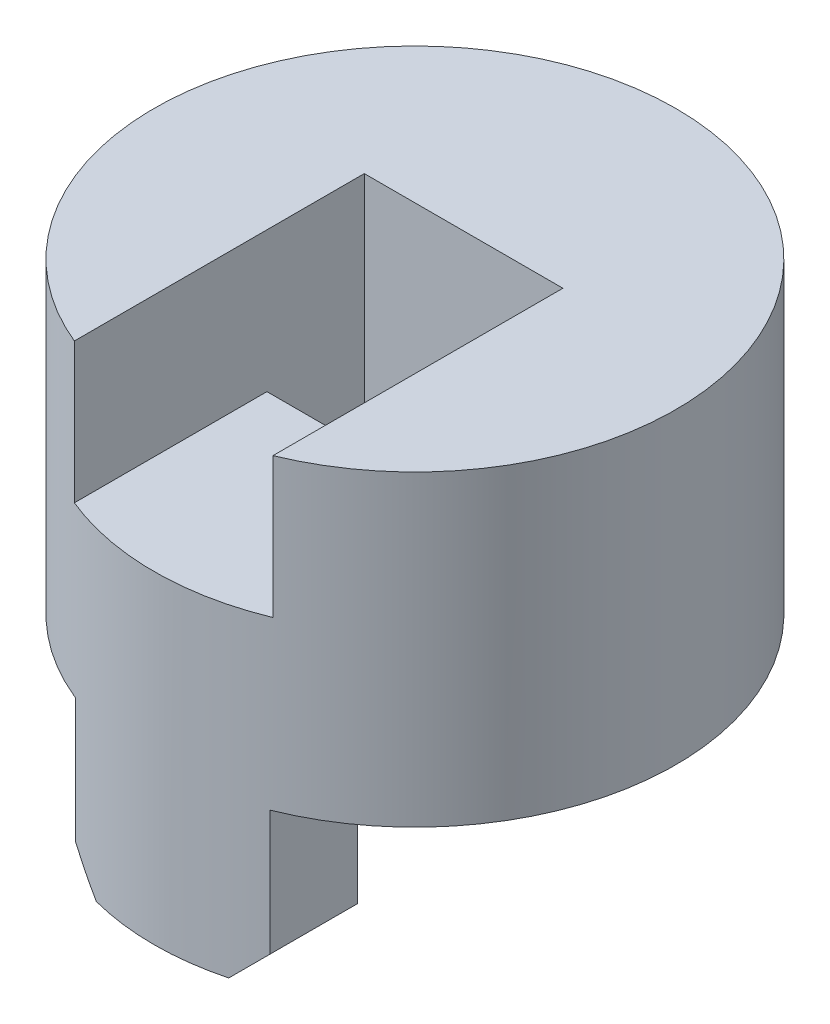
ISO-10303-21;
HEADER;
FILE_DESCRIPTION(('STEP AP214'),'2;1');
FILE_NAME('part.step','',(''),(''),'','','');
FILE_SCHEMA(('AUTOMOTIVE_DESIGN { 1 0 10303 214 1 1 1 1 }'));
ENDSEC;
DATA;
#1=APPLICATION_CONTEXT('core data for automotive mechanical design processes');
#2=APPLICATION_PROTOCOL_DEFINITION('international standard','automotive_design',2000,#1);
#3=PRODUCT_CONTEXT('',#1,'mechanical');
#4=PRODUCT('Part','Part','',(#3));
#5=PRODUCT_RELATED_PRODUCT_CATEGORY('part','',(#4));
#6=PRODUCT_DEFINITION_FORMATION('','',#4);
#7=PRODUCT_DEFINITION_CONTEXT('part definition',#1,'design');
#8=PRODUCT_DEFINITION('design','',#6,#7);
#9=PRODUCT_DEFINITION_SHAPE('','',#8);
#10=(LENGTH_UNIT() NAMED_UNIT(*) SI_UNIT(.MILLI.,.METRE.));
#11=(NAMED_UNIT(*) PLANE_ANGLE_UNIT() SI_UNIT($,.RADIAN.));
#12=(NAMED_UNIT(*) SI_UNIT($,.STERADIAN.) SOLID_ANGLE_UNIT());
#13=UNCERTAINTY_MEASURE_WITH_UNIT(LENGTH_MEASURE(1.E-05),#10,'distance_accuracy_value','');
#14=(GEOMETRIC_REPRESENTATION_CONTEXT(3) GLOBAL_UNCERTAINTY_ASSIGNED_CONTEXT((#13)) GLOBAL_UNIT_ASSIGNED_CONTEXT((#10,
#11,#12)) REPRESENTATION_CONTEXT('',''));
#15=CARTESIAN_POINT('',(0.,0.,0.));
#16=DIRECTION('',(0.,0.,1.));
#17=DIRECTION('',(1.,0.,0.));
#18=AXIS2_PLACEMENT_3D('',#15,#16,#17);
#19=CARTESIAN_POINT('',(0.,1.1,0.));
#20=DIRECTION('',(0.,1.,0.));
#21=DIRECTION('',(0.,0.,1.));
#22=AXIS2_PLACEMENT_3D('',#19,#20,#21);
#23=PLANE('',#22);
#24=CARTESIAN_POINT('',(0.,1.1,0.));
#25=DIRECTION('',(0.,1.,0.));
#26=DIRECTION('',(0.,0.,1.));
#27=AXIS2_PLACEMENT_3D('',#24,#25,#26);
#28=CIRCLE('',#27,3.45);
#29=CARTESIAN_POINT('',(0.,1.1,3.45));
#30=VERTEX_POINT('',#29);
#31=EDGE_CURVE('E198',#30,#30,#28,.T.);
#32=ORIENTED_EDGE('',*,*,#31,.T.);
#33=EDGE_LOOP('',(#32));
#34=FACE_BOUND('',#33,.T.);
#35=DIRECTION('',(0.,0.,1.));
#36=VECTOR('',#35,1.);
#37=CARTESIAN_POINT('',(2.5,1.1,0.));
#38=LINE('',#37,#36);
#39=CARTESIAN_POINT('',(2.5,1.1,3.97994974842648));
#40=VERTEX_POINT('',#39);
#41=CARTESIAN_POINT('',(2.5,1.1,6.21610810716802));
#42=VERTEX_POINT('',#41);
#43=EDGE_CURVE('E170',#40,#42,#38,.T.);
#44=ORIENTED_EDGE('',*,*,#43,.F.);
#45=CARTESIAN_POINT('',(0.,1.1,0.));
#46=DIRECTION('',(0.,-1.,0.));
#47=DIRECTION('',(0.,0.,-1.));
#48=AXIS2_PLACEMENT_3D('',#45,#46,#47);
#49=CIRCLE('',#48,4.7);
#50=CARTESIAN_POINT('',(-2.5,1.1,3.97994974842648));
#51=VERTEX_POINT('',#50);
#52=EDGE_CURVE('E159',#40,#51,#49,.T.);
#53=ORIENTED_EDGE('',*,*,#52,.T.);
#54=DIRECTION('',(0.,0.,1.));
#55=VECTOR('',#54,1.);
#56=CARTESIAN_POINT('',(-2.5,1.1,0.));
#57=LINE('',#56,#55);
#58=CARTESIAN_POINT('',(-2.5,1.1,6.21610810716802));
#59=VERTEX_POINT('',#58);
#60=EDGE_CURVE('E164',#51,#59,#57,.T.);
#61=ORIENTED_EDGE('',*,*,#60,.T.);
#62=CARTESIAN_POINT('',(0.,1.1,0.));
#63=DIRECTION('',(0.,1.,0.));
#64=DIRECTION('',(0.,0.,1.));
#65=AXIS2_PLACEMENT_3D('',#62,#63,#64);
#66=CIRCLE('',#65,6.7);
#67=EDGE_CURVE('E193',#42,#59,#66,.T.);
#68=ORIENTED_EDGE('',*,*,#67,.F.);
#69=EDGE_LOOP('',(#44,#53,#61,#68));
#70=FACE_BOUND('',#69,.T.);
#71=ADVANCED_FACE('F37',(#34,#70),#23,.F.);
#72=CARTESIAN_POINT('',(0.,1.1,0.));
#73=DIRECTION('',(0.,-1.,0.));
#74=DIRECTION('',(0.,0.,-1.));
#75=AXIS2_PLACEMENT_3D('',#72,#73,#74);
#76=CYLINDRICAL_SURFACE('',#75,3.45);
#77=ORIENTED_EDGE('',*,*,#31,.F.);
#78=EDGE_LOOP('',(#77));
#79=FACE_BOUND('',#78,.T.);
#80=CARTESIAN_POINT('',(0.,0.,0.));
#81=DIRECTION('',(0.,1.,0.));
#82=DIRECTION('',(0.,0.,1.));
#83=AXIS2_PLACEMENT_3D('',#80,#81,#82);
#84=CIRCLE('',#83,3.45);
#85=CARTESIAN_POINT('',(0.,0.,3.45));
#86=VERTEX_POINT('',#85);
#87=EDGE_CURVE('E202',#86,#86,#84,.T.);
#88=ORIENTED_EDGE('',*,*,#87,.T.);
#89=EDGE_LOOP('',(#88));
#90=FACE_BOUND('',#89,.T.);
#91=ADVANCED_FACE('F258',(#79,#90),#76,.T.);
#92=CARTESIAN_POINT('',(0.,0.,0.));
#93=DIRECTION('',(0.,1.,0.));
#94=DIRECTION('',(0.,0.,1.));
#95=AXIS2_PLACEMENT_3D('',#92,#93,#94);
#96=PLANE('',#95);
#97=DIRECTION('',(1.,0.,0.));
#98=VECTOR('',#97,1.);
#99=CARTESIAN_POINT('',(-2.55,0.,1.25));
#100=LINE('',#99,#98);
#101=CARTESIAN_POINT('',(-2.55,0.,1.25));
#102=VERTEX_POINT('',#101);
#103=CARTESIAN_POINT('',(2.55,0.,1.25));
#104=VERTEX_POINT('',#103);
#105=EDGE_CURVE('E189',#102,#104,#100,.T.);
#106=ORIENTED_EDGE('',*,*,#105,.T.);
#107=DIRECTION('',(0.,0.,-1.));
#108=VECTOR('',#107,1.);
#109=CARTESIAN_POINT('',(2.55,0.,1.25));
#110=LINE('',#109,#108);
#111=CARTESIAN_POINT('',(2.55,0.,-1.25));
#112=VERTEX_POINT('',#111);
#113=EDGE_CURVE('E183',#104,#112,#110,.T.);
#114=ORIENTED_EDGE('',*,*,#113,.T.);
#115=DIRECTION('',(-1.,0.,0.));
#116=VECTOR('',#115,1.);
#117=CARTESIAN_POINT('',(-2.55,0.,-1.25));
#118=LINE('',#117,#116);
#119=CARTESIAN_POINT('',(-2.55,0.,-1.25));
#120=VERTEX_POINT('',#119);
#121=EDGE_CURVE('E186',#112,#120,#118,.T.);
#122=ORIENTED_EDGE('',*,*,#121,.T.);
#123=DIRECTION('',(0.,0.,1.));
#124=VECTOR('',#123,1.);
#125=CARTESIAN_POINT('',(-2.55,0.,1.25));
#126=LINE('',#125,#124);
#127=EDGE_CURVE('E132',#120,#102,#126,.T.);
#128=ORIENTED_EDGE('',*,*,#127,.T.);
#129=EDGE_LOOP('',(#106,#114,#122,#128));
#130=FACE_BOUND('',#129,.T.);
#131=ORIENTED_EDGE('',*,*,#87,.F.);
#132=EDGE_LOOP('',(#131));
#133=FACE_BOUND('',#132,.T.);
#134=ADVANCED_FACE('F255',(#130,#133),#96,.F.);
#135=CARTESIAN_POINT('',(0.,5.4,0.));
#136=DIRECTION('',(0.,-1.,0.));
#137=DIRECTION('',(0.,0.,-1.));
#138=AXIS2_PLACEMENT_3D('',#135,#136,#137);
#139=CYLINDRICAL_SURFACE('',#138,6.7);
#140=CARTESIAN_POINT('',(0.,5.4,0.));
#141=DIRECTION('',(0.,1.,0.));
#142=DIRECTION('',(0.,0.,1.));
#143=AXIS2_PLACEMENT_3D('',#140,#141,#142);
#144=CIRCLE('',#143,6.7);
#145=CARTESIAN_POINT('',(-2.55,5.4,6.19576468242621));
#146=VERTEX_POINT('',#145);
#147=CARTESIAN_POINT('',(2.55,5.4,6.19576468242621));
#148=VERTEX_POINT('',#147);
#149=EDGE_CURVE('E196',#146,#148,#144,.T.);
#150=ORIENTED_EDGE('',*,*,#149,.F.);
#151=DIRECTION('',(0.,-1.,0.));
#152=VECTOR('',#151,1.);
#153=CARTESIAN_POINT('',(-2.55,35.4973317103425,6.19576468242621));
#154=LINE('',#153,#152);
#155=CARTESIAN_POINT('',(-2.55,9.,6.19576468242621));
#156=VERTEX_POINT('',#155);
#157=EDGE_CURVE('E54',#156,#146,#154,.T.);
#158=ORIENTED_EDGE('',*,*,#157,.F.);
#159=CARTESIAN_POINT('',(0.,9.,0.));
#160=DIRECTION('',(0.,1.,0.));
#161=DIRECTION('',(0.,0.,1.));
#162=AXIS2_PLACEMENT_3D('',#159,#160,#161);
#163=CIRCLE('',#162,6.7);
#164=CARTESIAN_POINT('',(2.55,9.,6.19576468242621));
#165=VERTEX_POINT('',#164);
#166=EDGE_CURVE('E149',#165,#156,#163,.T.);
#167=ORIENTED_EDGE('',*,*,#166,.F.);
#168=DIRECTION('',(0.,-1.,0.));
#169=VECTOR('',#168,1.);
#170=CARTESIAN_POINT('',(2.55,35.4973317103425,6.19576468242621));
#171=LINE('',#170,#169);
#172=EDGE_CURVE('E150',#165,#148,#171,.T.);
#173=ORIENTED_EDGE('',*,*,#172,.T.);
#174=EDGE_LOOP('',(#150,#158,#167,#173));
#175=FACE_BOUND('',#174,.T.);
#176=CARTESIAN_POINT('',(0.,-2.9,0.));
#177=DIRECTION('',(0.,-1.,0.));
#178=DIRECTION('',(0.,0.,-1.));
#179=AXIS2_PLACEMENT_3D('',#176,#177,#178);
#180=CIRCLE('',#179,6.7);
#181=CARTESIAN_POINT('',(1.7,-2.9,6.48074069840786));
#182=VERTEX_POINT('',#181);
#183=CARTESIAN_POINT('',(-1.69999999999999,-2.9,6.48074069840786));
#184=VERTEX_POINT('',#183);
#185=EDGE_CURVE('E163',#182,#184,#180,.T.);
#186=ORIENTED_EDGE('',*,*,#185,.F.);
#187=CARTESIAN_POINT('',(0.,-4.6,0.));
#188=DIRECTION('',(0.707106781186549,-0.707106781186546,0.));
#189=DIRECTION('',(-0.707106781186546,-0.707106781186549,0.));
#190=AXIS2_PLACEMENT_3D('',#187,#188,#189);
#191=ELLIPSE('',#190,9.47523086789976,6.7);
#192=CARTESIAN_POINT('',(2.5,-2.09999999999999,6.21610810716802));
#193=VERTEX_POINT('',#192);
#194=EDGE_CURVE('E211',#182,#193,#191,.F.);
#195=ORIENTED_EDGE('',*,*,#194,.T.);
#196=DIRECTION('',(0.,1.,0.));
#197=VECTOR('',#196,1.);
#198=CARTESIAN_POINT('',(2.5,-2.9,6.21610810716802));
#199=LINE('',#198,#197);
#200=EDGE_CURVE('E178',#193,#42,#199,.T.);
#201=ORIENTED_EDGE('',*,*,#200,.T.);
#202=ORIENTED_EDGE('',*,*,#67,.T.);
#203=DIRECTION('',(0.,1.,0.));
#204=VECTOR('',#203,1.);
#205=CARTESIAN_POINT('',(-2.5,-2.9,6.21610810716802));
#206=LINE('',#205,#204);
#207=CARTESIAN_POINT('',(-2.5,-2.1,6.21610810716802));
#208=VERTEX_POINT('',#207);
#209=EDGE_CURVE('E176',#208,#59,#206,.T.);
#210=ORIENTED_EDGE('',*,*,#209,.F.);
#211=CARTESIAN_POINT('',(0.,-4.59999999999999,0.));
#212=DIRECTION('',(0.707106781186546,0.707106781186549,0.));
#213=DIRECTION('',(0.707106781186549,-0.707106781186546,0.));
#214=AXIS2_PLACEMENT_3D('',#211,#212,#213);
#215=ELLIPSE('',#214,9.47523086789972,6.7);
#216=EDGE_CURVE('E209',#208,#184,#215,.T.);
#217=ORIENTED_EDGE('',*,*,#216,.T.);
#218=EDGE_LOOP('',(#186,#195,#201,#202,#210,#217));
#219=FACE_BOUND('',#218,.T.);
#220=ADVANCED_FACE('F252',(#175,#219),#139,.T.);
#221=CARTESIAN_POINT('',(0.,5.4,0.));
#222=DIRECTION('',(0.,1.,0.));
#223=DIRECTION('',(0.,0.,1.));
#224=AXIS2_PLACEMENT_3D('',#221,#222,#223);
#225=PLANE('',#224);
#226=DIRECTION('',(0.,0.,1.));
#227=VECTOR('',#226,1.);
#228=CARTESIAN_POINT('',(2.55,5.4,0.));
#229=LINE('',#228,#227);
#230=CARTESIAN_POINT('',(2.55,5.4,1.25));
#231=VERTEX_POINT('',#230);
#232=EDGE_CURVE('E12',#231,#148,#229,.T.);
#233=ORIENTED_EDGE('',*,*,#232,.F.);
#234=DIRECTION('',(1.,0.,0.));
#235=VECTOR('',#234,1.);
#236=CARTESIAN_POINT('',(-2.55,5.4,1.25));
#237=LINE('',#236,#235);
#238=CARTESIAN_POINT('',(-2.55,5.4,1.25));
#239=VERTEX_POINT('',#238);
#240=EDGE_CURVE('E182',#239,#231,#237,.T.);
#241=ORIENTED_EDGE('',*,*,#240,.F.);
#242=DIRECTION('',(0.,0.,1.));
#243=VECTOR('',#242,1.);
#244=CARTESIAN_POINT('',(-2.55,5.4,0.));
#245=LINE('',#244,#243);
#246=EDGE_CURVE('E46',#239,#146,#245,.T.);
#247=ORIENTED_EDGE('',*,*,#246,.T.);
#248=ORIENTED_EDGE('',*,*,#149,.T.);
#249=EDGE_LOOP('',(#233,#241,#247,#248));
#250=FACE_BOUND('',#249,.T.);
#251=ADVANCED_FACE('F249',(#250),#225,.T.);
#252=CARTESIAN_POINT('',(2.55,0.,1.25));
#253=DIRECTION('',(1.,0.,0.));
#254=DIRECTION('',(0.,0.,-1.));
#255=AXIS2_PLACEMENT_3D('',#252,#253,#254);
#256=PLANE('',#255);
#257=DIRECTION('',(0.,1.,0.));
#258=VECTOR('',#257,1.);
#259=CARTESIAN_POINT('',(2.55,0.,1.25));
#260=LINE('',#259,#258);
#261=EDGE_CURVE('E197',#104,#231,#260,.T.);
#262=ORIENTED_EDGE('',*,*,#261,.T.);
#263=ORIENTED_EDGE('',*,*,#232,.T.);
#264=ORIENTED_EDGE('',*,*,#172,.F.);
#265=DIRECTION('',(0.,0.,1.));
#266=VECTOR('',#265,1.);
#267=CARTESIAN_POINT('',(2.55,9.,0.));
#268=LINE('',#267,#266);
#269=CARTESIAN_POINT('',(2.55,9.,-1.25));
#270=VERTEX_POINT('',#269);
#271=EDGE_CURVE('E145',#270,#165,#268,.T.);
#272=ORIENTED_EDGE('',*,*,#271,.F.);
#273=DIRECTION('',(0.,1.,0.));
#274=VECTOR('',#273,1.);
#275=CARTESIAN_POINT('',(2.55,0.,-1.25));
#276=LINE('',#275,#274);
#277=EDGE_CURVE('E137',#112,#270,#276,.T.);
#278=ORIENTED_EDGE('',*,*,#277,.F.);
#279=ORIENTED_EDGE('',*,*,#113,.F.);
#280=EDGE_LOOP('',(#262,#263,#264,#272,#278,#279));
#281=FACE_BOUND('',#280,.T.);
#282=ADVANCED_FACE('F242',(#281),#256,.F.);
#283=CARTESIAN_POINT('',(-2.55,0.,1.25));
#284=DIRECTION('',(0.,0.,1.));
#285=DIRECTION('',(1.,0.,0.));
#286=AXIS2_PLACEMENT_3D('',#283,#284,#285);
#287=PLANE('',#286);
#288=ORIENTED_EDGE('',*,*,#240,.T.);
#289=ORIENTED_EDGE('',*,*,#261,.F.);
#290=ORIENTED_EDGE('',*,*,#105,.F.);
#291=DIRECTION('',(0.,1.,0.));
#292=VECTOR('',#291,1.);
#293=CARTESIAN_POINT('',(-2.55,0.,1.25));
#294=LINE('',#293,#292);
#295=EDGE_CURVE('E136',#102,#239,#294,.T.);
#296=ORIENTED_EDGE('',*,*,#295,.T.);
#297=EDGE_LOOP('',(#288,#289,#290,#296));
#298=FACE_BOUND('',#297,.T.);
#299=ADVANCED_FACE('F247',(#298),#287,.F.);
#300=CARTESIAN_POINT('',(-2.55,0.,1.25));
#301=DIRECTION('',(-1.,0.,0.));
#302=DIRECTION('',(0.,0.,1.));
#303=AXIS2_PLACEMENT_3D('',#300,#301,#302);
#304=PLANE('',#303);
#305=DIRECTION('',(0.,1.,0.));
#306=VECTOR('',#305,1.);
#307=CARTESIAN_POINT('',(-2.55,0.,-1.25));
#308=LINE('',#307,#306);
#309=CARTESIAN_POINT('',(-2.55,9.,-1.25));
#310=VERTEX_POINT('',#309);
#311=EDGE_CURVE('E126',#120,#310,#308,.T.);
#312=ORIENTED_EDGE('',*,*,#311,.T.);
#313=DIRECTION('',(0.,0.,1.));
#314=VECTOR('',#313,1.);
#315=CARTESIAN_POINT('',(-2.55,9.,0.));
#316=LINE('',#315,#314);
#317=EDGE_CURVE('E130',#310,#156,#316,.T.);
#318=ORIENTED_EDGE('',*,*,#317,.T.);
#319=ORIENTED_EDGE('',*,*,#157,.T.);
#320=ORIENTED_EDGE('',*,*,#246,.F.);
#321=ORIENTED_EDGE('',*,*,#295,.F.);
#322=ORIENTED_EDGE('',*,*,#127,.F.);
#323=EDGE_LOOP('',(#312,#318,#319,#320,#321,#322));
#324=FACE_BOUND('',#323,.T.);
#325=ADVANCED_FACE('F128',(#324),#304,.F.);
#326=CARTESIAN_POINT('',(-2.55,0.,-1.25));
#327=DIRECTION('',(0.,0.,-1.));
#328=DIRECTION('',(-1.,0.,0.));
#329=AXIS2_PLACEMENT_3D('',#326,#327,#328);
#330=PLANE('',#329);
#331=ORIENTED_EDGE('',*,*,#277,.T.);
#332=DIRECTION('',(1.,0.,0.));
#333=VECTOR('',#332,1.);
#334=CARTESIAN_POINT('',(0.,9.,-1.25));
#335=LINE('',#334,#333);
#336=EDGE_CURVE('E140',#310,#270,#335,.T.);
#337=ORIENTED_EDGE('',*,*,#336,.F.);
#338=ORIENTED_EDGE('',*,*,#311,.F.);
#339=ORIENTED_EDGE('',*,*,#121,.F.);
#340=EDGE_LOOP('',(#331,#337,#338,#339));
#341=FACE_BOUND('',#340,.T.);
#342=ADVANCED_FACE('F141',(#341),#330,.F.);
#343=CARTESIAN_POINT('',(0.,-2.9,0.));
#344=DIRECTION('',(0.,1.,0.));
#345=DIRECTION('',(0.,0.,1.));
#346=AXIS2_PLACEMENT_3D('',#343,#344,#345);
#347=CYLINDRICAL_SURFACE('',#346,4.7);
#348=DIRECTION('',(0.,1.,0.));
#349=VECTOR('',#348,1.);
#350=CARTESIAN_POINT('',(2.5,-2.9,3.97994974842648));
#351=LINE('',#350,#349);
#352=CARTESIAN_POINT('',(2.5,-2.09999999999999,3.97994974842648));
#353=VERTEX_POINT('',#352);
#354=EDGE_CURVE('E180',#353,#40,#351,.T.);
#355=ORIENTED_EDGE('',*,*,#354,.F.);
#356=CARTESIAN_POINT('',(0.,-4.6,0.));
#357=DIRECTION('',(0.707106781186549,-0.707106781186546,0.));
#358=DIRECTION('',(0.707106781186546,0.707106781186549,0.));
#359=AXIS2_PLACEMENT_3D('',#356,#357,#358);
#360=ELLIPSE('',#359,6.64680374315356,4.7);
#361=CARTESIAN_POINT('',(1.7,-2.9,4.38178046004133));
#362=VERTEX_POINT('',#361);
#363=EDGE_CURVE('E216',#353,#362,#360,.T.);
#364=ORIENTED_EDGE('',*,*,#363,.T.);
#365=CARTESIAN_POINT('',(0.,-2.9,0.));
#366=DIRECTION('',(0.,-1.,0.));
#367=DIRECTION('',(0.,0.,-1.));
#368=AXIS2_PLACEMENT_3D('',#365,#366,#367);
#369=CIRCLE('',#368,4.7);
#370=CARTESIAN_POINT('',(-1.7,-2.9,4.38178046004133));
#371=VERTEX_POINT('',#370);
#372=EDGE_CURVE('E161',#362,#371,#369,.T.);
#373=ORIENTED_EDGE('',*,*,#372,.T.);
#374=CARTESIAN_POINT('',(0.,-4.59999999999999,0.));
#375=DIRECTION('',(0.707106781186546,0.707106781186549,0.));
#376=DIRECTION('',(-0.707106781186549,0.707106781186546,0.));
#377=AXIS2_PLACEMENT_3D('',#374,#375,#376);
#378=ELLIPSE('',#377,6.64680374315353,4.7);
#379=CARTESIAN_POINT('',(-2.5,-2.1,3.97994974842648));
#380=VERTEX_POINT('',#379);
#381=EDGE_CURVE('E62',#371,#380,#378,.F.);
#382=ORIENTED_EDGE('',*,*,#381,.T.);
#383=DIRECTION('',(0.,1.,0.));
#384=VECTOR('',#383,1.);
#385=CARTESIAN_POINT('',(-2.5,-2.9,3.97994974842648));
#386=LINE('',#385,#384);
#387=EDGE_CURVE('E167',#380,#51,#386,.T.);
#388=ORIENTED_EDGE('',*,*,#387,.T.);
#389=ORIENTED_EDGE('',*,*,#52,.F.);
#390=EDGE_LOOP('',(#355,#364,#373,#382,#388,#389));
#391=FACE_BOUND('',#390,.T.);
#392=ADVANCED_FACE('F289',(#391),#347,.F.);
#393=CARTESIAN_POINT('',(2.5,-2.9,0.));
#394=DIRECTION('',(-1.,0.,0.));
#395=DIRECTION('',(0.,0.,1.));
#396=AXIS2_PLACEMENT_3D('',#393,#394,#395);
#397=PLANE('',#396);
#398=ORIENTED_EDGE('',*,*,#200,.F.);
#399=DIRECTION('',(0.,0.,-1.));
#400=VECTOR('',#399,1.);
#401=CARTESIAN_POINT('',(2.5,-2.09999999999999,3.97994974842648));
#402=LINE('',#401,#400);
#403=EDGE_CURVE('E213',#193,#353,#402,.T.);
#404=ORIENTED_EDGE('',*,*,#403,.T.);
#405=ORIENTED_EDGE('',*,*,#354,.T.);
#406=ORIENTED_EDGE('',*,*,#43,.T.);
#407=EDGE_LOOP('',(#398,#404,#405,#406));
#408=FACE_BOUND('',#407,.T.);
#409=ADVANCED_FACE('F302',(#408),#397,.F.);
#410=CARTESIAN_POINT('',(-2.5,-2.9,0.));
#411=DIRECTION('',(-1.,0.,0.));
#412=DIRECTION('',(0.,0.,1.));
#413=AXIS2_PLACEMENT_3D('',#410,#411,#412);
#414=PLANE('',#413);
#415=ORIENTED_EDGE('',*,*,#387,.F.);
#416=DIRECTION('',(0.,0.,1.));
#417=VECTOR('',#416,1.);
#418=CARTESIAN_POINT('',(-2.5,-2.1,0.));
#419=LINE('',#418,#417);
#420=EDGE_CURVE('E218',#380,#208,#419,.T.);
#421=ORIENTED_EDGE('',*,*,#420,.T.);
#422=ORIENTED_EDGE('',*,*,#209,.T.);
#423=ORIENTED_EDGE('',*,*,#60,.F.);
#424=EDGE_LOOP('',(#415,#421,#422,#423));
#425=FACE_BOUND('',#424,.T.);
#426=ADVANCED_FACE('F281',(#425),#414,.T.);
#427=CARTESIAN_POINT('',(0.,-2.9,0.));
#428=DIRECTION('',(0.,-1.,0.));
#429=DIRECTION('',(0.,0.,-1.));
#430=AXIS2_PLACEMENT_3D('',#427,#428,#429);
#431=PLANE('',#430);
#432=ORIENTED_EDGE('',*,*,#372,.F.);
#433=DIRECTION('',(0.,0.,1.));
#434=VECTOR('',#433,1.);
#435=CARTESIAN_POINT('',(1.7,-2.9,6.21610810716802));
#436=LINE('',#435,#434);
#437=EDGE_CURVE('E206',#362,#182,#436,.T.);
#438=ORIENTED_EDGE('',*,*,#437,.T.);
#439=ORIENTED_EDGE('',*,*,#185,.T.);
#440=DIRECTION('',(0.,0.,-1.));
#441=VECTOR('',#440,1.);
#442=CARTESIAN_POINT('',(-1.69999999999999,-2.9,0.));
#443=LINE('',#442,#441);
#444=EDGE_CURVE('E201',#184,#371,#443,.T.);
#445=ORIENTED_EDGE('',*,*,#444,.T.);
#446=EDGE_LOOP('',(#432,#438,#439,#445));
#447=FACE_BOUND('',#446,.T.);
#448=ADVANCED_FACE('F274',(#447),#431,.T.);
#449=CARTESIAN_POINT('',(1.7,-2.9,0.));
#450=DIRECTION('',(0.707106781186549,-0.707106781186546,0.));
#451=DIRECTION('',(0.,0.,-1.));
#452=AXIS2_PLACEMENT_3D('',#449,#450,#451);
#453=PLANE('',#452);
#454=ORIENTED_EDGE('',*,*,#363,.F.);
#455=ORIENTED_EDGE('',*,*,#403,.F.);
#456=ORIENTED_EDGE('',*,*,#194,.F.);
#457=ORIENTED_EDGE('',*,*,#437,.F.);
#458=EDGE_LOOP('',(#454,#455,#456,#457));
#459=FACE_BOUND('',#458,.T.);
#460=ADVANCED_FACE('F272',(#459),#453,.T.);
#461=CARTESIAN_POINT('',(-2.5,-2.1,0.));
#462=DIRECTION('',(0.707106781186546,0.707106781186549,0.));
#463=DIRECTION('',(0.,0.,1.));
#464=AXIS2_PLACEMENT_3D('',#461,#462,#463);
#465=PLANE('',#464);
#466=ORIENTED_EDGE('',*,*,#381,.F.);
#467=ORIENTED_EDGE('',*,*,#444,.F.);
#468=ORIENTED_EDGE('',*,*,#216,.F.);
#469=ORIENTED_EDGE('',*,*,#420,.F.);
#470=EDGE_LOOP('',(#466,#467,#468,#469));
#471=FACE_BOUND('',#470,.T.);
#472=ADVANCED_FACE('F39',(#471),#465,.F.);
#473=CARTESIAN_POINT('',(0.,9.,0.));
#474=DIRECTION('',(0.,1.,0.));
#475=DIRECTION('',(0.,0.,1.));
#476=AXIS2_PLACEMENT_3D('',#473,#474,#475);
#477=PLANE('',#476);
#478=ORIENTED_EDGE('',*,*,#336,.T.);
#479=ORIENTED_EDGE('',*,*,#271,.T.);
#480=ORIENTED_EDGE('',*,*,#166,.T.);
#481=ORIENTED_EDGE('',*,*,#317,.F.);
#482=EDGE_LOOP('',(#478,#479,#480,#481));
#483=FACE_BOUND('',#482,.T.);
#484=ADVANCED_FACE('F148',(#483),#477,.T.);
#485=CLOSED_SHELL('',(#71,#91,#134,#220,#251,#282,#299,#325,#342,#392,#409,#426,#448,#460,#472,#484));
#486=MANIFOLD_SOLID_BREP('B2',#485);
#487=ADVANCED_BREP_SHAPE_REPRESENTATION('',(#18,#486),#14);
#488=SHAPE_DEFINITION_REPRESENTATION(#9,#487);
ENDSEC;
END-ISO-10303-21;
